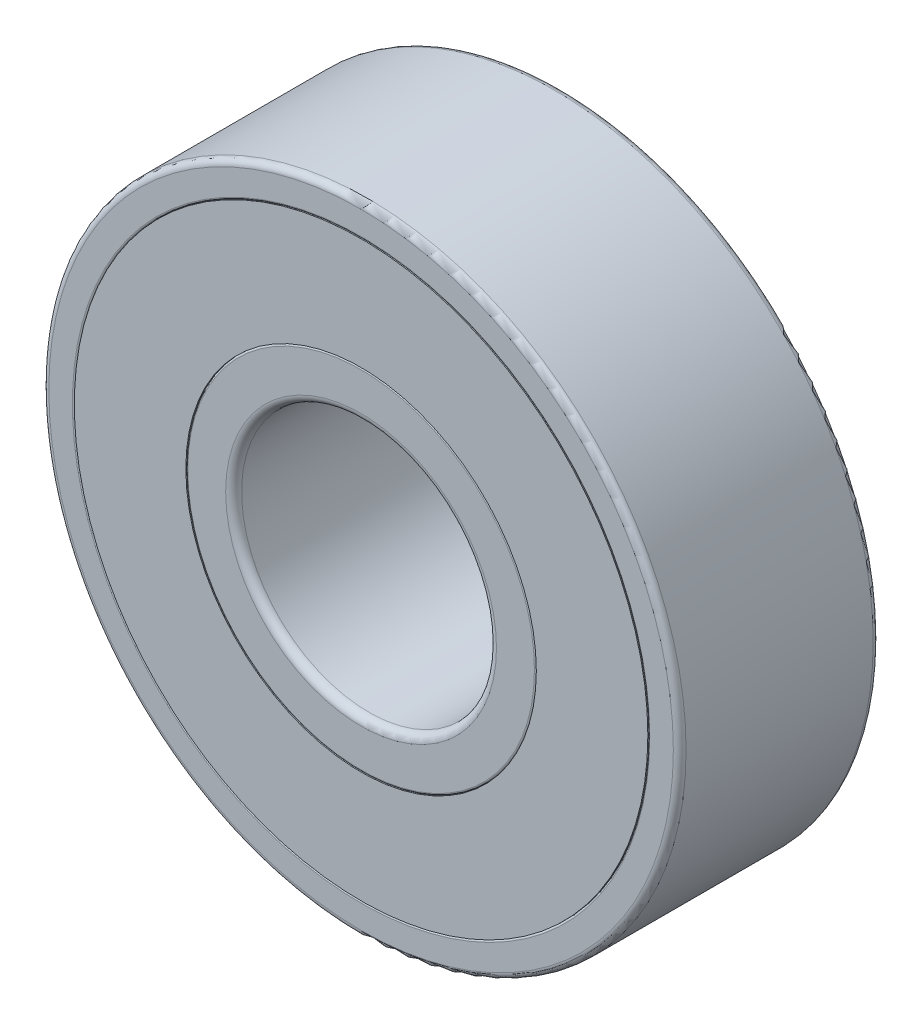
ISO-10303-21;
HEADER;
FILE_DESCRIPTION(('STEP AP214'),'2;1');
FILE_NAME('part.step','',(''),(''),'','','');
FILE_SCHEMA(('AUTOMOTIVE_DESIGN { 1 0 10303 214 1 1 1 1 }'));
ENDSEC;
DATA;
#1=APPLICATION_CONTEXT('core data for automotive mechanical design processes');
#2=APPLICATION_PROTOCOL_DEFINITION('international standard','automotive_design',2000,#1);
#3=PRODUCT_CONTEXT('',#1,'mechanical');
#4=PRODUCT('Part','Part','',(#3));
#5=PRODUCT_RELATED_PRODUCT_CATEGORY('part','',(#4));
#6=PRODUCT_DEFINITION_FORMATION('','',#4);
#7=PRODUCT_DEFINITION_CONTEXT('part definition',#1,'design');
#8=PRODUCT_DEFINITION('design','',#6,#7);
#9=PRODUCT_DEFINITION_SHAPE('','',#8);
#10=(LENGTH_UNIT() NAMED_UNIT(*) SI_UNIT(.MILLI.,.METRE.));
#11=(NAMED_UNIT(*) PLANE_ANGLE_UNIT() SI_UNIT($,.RADIAN.));
#12=(NAMED_UNIT(*) SI_UNIT($,.STERADIAN.) SOLID_ANGLE_UNIT());
#13=UNCERTAINTY_MEASURE_WITH_UNIT(LENGTH_MEASURE(1.E-05),#10,'distance_accuracy_value','');
#14=(GEOMETRIC_REPRESENTATION_CONTEXT(3) GLOBAL_UNCERTAINTY_ASSIGNED_CONTEXT((#13)) GLOBAL_UNIT_ASSIGNED_CONTEXT((#10,
#11,#12)) REPRESENTATION_CONTEXT('',''));
#15=CARTESIAN_POINT('',(0.,0.,0.));
#16=DIRECTION('',(0.,0.,1.));
#17=DIRECTION('',(1.,0.,0.));
#18=AXIS2_PLACEMENT_3D('',#15,#16,#17);
#19=CARTESIAN_POINT('',(0.,0.,2.4892));
#20=DIRECTION('',(0.,0.,1.));
#21=DIRECTION('',(1.,0.,0.));
#22=AXIS2_PLACEMENT_3D('',#19,#20,#21);
#23=PLANE('',#22);
#24=CARTESIAN_POINT('',(0.,0.,2.4892));
#25=DIRECTION('',(0.,0.,1.));
#26=DIRECTION('',(1.,0.,0.));
#27=AXIS2_PLACEMENT_3D('',#24,#25,#26);
#28=CIRCLE('',#27,7.14375);
#29=CARTESIAN_POINT('',(7.14375,0.,2.4892));
#30=VERTEX_POINT('',#29);
#31=EDGE_CURVE('E11',#30,#30,#28,.T.);
#32=ORIENTED_EDGE('',*,*,#31,.T.);
#33=EDGE_LOOP('',(#32));
#34=FACE_BOUND('',#33,.T.);
#35=CARTESIAN_POINT('',(0.,0.,2.4892));
#36=DIRECTION('',(0.,0.,1.));
#37=DIRECTION('',(1.,0.,0.));
#38=AXIS2_PLACEMENT_3D('',#35,#36,#37);
#39=CIRCLE('',#38,4.365625);
#40=CARTESIAN_POINT('',(4.365625,0.,2.4892));
#41=VERTEX_POINT('',#40);
#42=EDGE_CURVE('E67',#41,#41,#39,.T.);
#43=ORIENTED_EDGE('',*,*,#42,.F.);
#44=EDGE_LOOP('',(#43));
#45=FACE_BOUND('',#44,.T.);
#46=ADVANCED_FACE('F54',(#34,#45),#23,.T.);
#47=CARTESIAN_POINT('',(0.,0.,-2.4892));
#48=DIRECTION('',(0.,0.,1.));
#49=DIRECTION('',(1.,0.,0.));
#50=AXIS2_PLACEMENT_3D('',#47,#48,#49);
#51=PLANE('',#50);
#52=CARTESIAN_POINT('',(0.,0.,-2.4892));
#53=DIRECTION('',(0.,0.,1.));
#54=DIRECTION('',(1.,0.,0.));
#55=AXIS2_PLACEMENT_3D('',#52,#53,#54);
#56=CIRCLE('',#55,7.14375);
#57=CARTESIAN_POINT('',(7.14375,0.,-2.4892));
#58=VERTEX_POINT('',#57);
#59=EDGE_CURVE('E58',#58,#58,#56,.T.);
#60=ORIENTED_EDGE('',*,*,#59,.F.);
#61=EDGE_LOOP('',(#60));
#62=FACE_BOUND('',#61,.T.);
#63=CARTESIAN_POINT('',(0.,0.,-2.4892));
#64=DIRECTION('',(0.,0.,1.));
#65=DIRECTION('',(1.,0.,0.));
#66=AXIS2_PLACEMENT_3D('',#63,#64,#65);
#67=CIRCLE('',#66,4.365625);
#68=CARTESIAN_POINT('',(4.365625,0.,-2.4892));
#69=VERTEX_POINT('',#68);
#70=EDGE_CURVE('E69',#69,#69,#67,.T.);
#71=ORIENTED_EDGE('',*,*,#70,.T.);
#72=EDGE_LOOP('',(#71));
#73=FACE_BOUND('',#72,.T.);
#74=ADVANCED_FACE('F81',(#62,#73),#51,.F.);
#75=CARTESIAN_POINT('',(0.,0.,2.4892));
#76=DIRECTION('',(0.,0.,-1.));
#77=DIRECTION('',(-1.,0.,0.));
#78=AXIS2_PLACEMENT_3D('',#75,#76,#77);
#79=CYLINDRICAL_SURFACE('',#78,7.14375);
#80=ORIENTED_EDGE('',*,*,#31,.F.);
#81=EDGE_LOOP('',(#80));
#82=FACE_BOUND('',#81,.T.);
#83=ORIENTED_EDGE('',*,*,#59,.T.);
#84=EDGE_LOOP('',(#83));
#85=FACE_BOUND('',#84,.T.);
#86=ADVANCED_FACE('F56',(#82,#85),#79,.T.);
#87=CARTESIAN_POINT('',(0.,0.,2.4892));
#88=DIRECTION('',(0.,0.,-1.));
#89=DIRECTION('',(-1.,0.,0.));
#90=AXIS2_PLACEMENT_3D('',#87,#88,#89);
#91=CYLINDRICAL_SURFACE('',#90,4.365625);
#92=ORIENTED_EDGE('',*,*,#42,.T.);
#93=EDGE_LOOP('',(#92));
#94=FACE_BOUND('',#93,.T.);
#95=ORIENTED_EDGE('',*,*,#70,.F.);
#96=EDGE_LOOP('',(#95));
#97=FACE_BOUND('',#96,.T.);
#98=ADVANCED_FACE('F77',(#94,#97),#91,.F.);
#99=CLOSED_SHELL('',(#46,#74,#86,#98));
#100=MANIFOLD_SOLID_BREP('B2',#99);
#101=CARTESIAN_POINT('',(4.4991958592652,-3.58798896913399,0.));
#102=DIRECTION('',(-0.781831482468022,0.623489801858743,0.));
#103=DIRECTION('',(0.,0.,-1.));
#104=AXIS2_PLACEMENT_3D('',#101,#102,#103);
#105=SPHERICAL_SURFACE('',#104,1.666875);
#106=CARTESIAN_POINT('',(3.19598050692631,-2.54870940566069,0.));
#107=VERTEX_POINT('',#106);
#108=VERTEX_LOOP('',#107);
#109=FACE_BOUND('',#108,.T.);
#110=ADVANCED_FACE('F130',(#109),#105,.T.);
#111=CLOSED_SHELL('',(#110));
#112=MANIFOLD_SOLID_BREP('B6',#111);
#113=CARTESIAN_POINT('',(5.61040546963385,1.28053843712667,0.));
#114=DIRECTION('',(-0.974927912181826,-0.222520933956305,0.));
#115=DIRECTION('',(0.,0.,-1.));
#116=AXIS2_PLACEMENT_3D('',#113,#114,#115);
#117=SPHERICAL_SURFACE('',#116,1.666875);
#118=CARTESIAN_POINT('',(3.98532250601577,0.909623855338258,0.));
#119=VERTEX_POINT('',#118);
#120=VERTEX_LOOP('',#119);
#121=FACE_BOUND('',#120,.T.);
#122=ADVANCED_FACE('F147',(#121),#117,.T.);
#123=CLOSED_SHELL('',(#122));
#124=MANIFOLD_SOLID_BREP('B50',#123);
#125=CARTESIAN_POINT('',(2.49686532995311,5.18479428200718,0.));
#126=DIRECTION('',(-0.433883739117565,-0.900968867902416,0.));
#127=DIRECTION('',(0.,0.,-1.));
#128=AXIS2_PLACEMENT_3D('',#125,#126,#127);
#129=SPHERICAL_SURFACE('',#128,1.666875);
#130=CARTESIAN_POINT('',(1.77363537231152,3.68299180032234,0.));
#131=VERTEX_POINT('',#130);
#132=VERTEX_LOOP('',#131);
#133=FACE_BOUND('',#132,.T.);
#134=ADVANCED_FACE('F164',(#133),#129,.T.);
#135=CLOSED_SHELL('',(#134));
#136=MANIFOLD_SOLID_BREP('B126',#135);
#137=CARTESIAN_POINT('',(-2.49686532995304,5.18479428200722,0.));
#138=DIRECTION('',(0.433883739117553,-0.900968867902422,0.));
#139=DIRECTION('',(0.,0.,-1.));
#140=AXIS2_PLACEMENT_3D('',#137,#138,#139);
#141=SPHERICAL_SURFACE('',#140,1.666875);
#142=CARTESIAN_POINT('',(-1.77363537231147,3.68299180032237,0.));
#143=VERTEX_POINT('',#142);
#144=VERTEX_LOOP('',#143);
#145=FACE_BOUND('',#144,.T.);
#146=ADVANCED_FACE('F181',(#145),#141,.T.);
#147=CLOSED_SHELL('',(#146));
#148=MANIFOLD_SOLID_BREP('B143',#147);
#149=CARTESIAN_POINT('',(-5.61040546963383,1.28053843712675,0.));
#150=DIRECTION('',(0.974927912181823,-0.222520933956318,0.));
#151=DIRECTION('',(0.,0.,-1.));
#152=AXIS2_PLACEMENT_3D('',#149,#150,#151);
#153=SPHERICAL_SURFACE('',#152,1.666875);
#154=CARTESIAN_POINT('',(-3.98532250601576,0.909623855338312,0.));
#155=VERTEX_POINT('',#154);
#156=VERTEX_LOOP('',#155);
#157=FACE_BOUND('',#156,.T.);
#158=ADVANCED_FACE('F198',(#157),#153,.T.);
#159=CLOSED_SHELL('',(#158));
#160=MANIFOLD_SOLID_BREP('B160',#159);
#161=CARTESIAN_POINT('',(-4.49919585926525,-3.58798896913392,0.));
#162=DIRECTION('',(0.781831482468031,0.623489801858732,0.));
#163=DIRECTION('',(0.,0.,-1.));
#164=AXIS2_PLACEMENT_3D('',#161,#162,#163);
#165=SPHERICAL_SURFACE('',#164,1.666875);
#166=CARTESIAN_POINT('',(-3.19598050692635,-2.54870940566065,0.));
#167=VERTEX_POINT('',#166);
#168=VERTEX_LOOP('',#167);
#169=FACE_BOUND('',#168,.T.);
#170=ADVANCED_FACE('F215',(#169),#165,.T.);
#171=CLOSED_SHELL('',(#170));
#172=MANIFOLD_SOLID_BREP('B177',#171);
#173=CARTESIAN_POINT('',(0.,-5.7546875,0.));
#174=DIRECTION('',(0.,1.,0.));
#175=DIRECTION('',(0.,0.,-1.));
#176=AXIS2_PLACEMENT_3D('',#173,#174,#175);
#177=SPHERICAL_SURFACE('',#176,1.666875);
#178=CARTESIAN_POINT('',(0.,-4.0878125,0.));
#179=VERTEX_POINT('',#178);
#180=VERTEX_LOOP('',#179);
#181=FACE_BOUND('',#180,.T.);
#182=ADVANCED_FACE('F234',(#181),#177,.T.);
#183=CLOSED_SHELL('',(#182));
#184=MANIFOLD_SOLID_BREP('B194',#183);
#185=CARTESIAN_POINT('',(0.,0.,2.4892));
#186=DIRECTION('',(0.,0.,1.));
#187=DIRECTION('',(1.,0.,0.));
#188=AXIS2_PLACEMENT_3D('',#185,#186,#187);
#189=CYLINDRICAL_SURFACE('',#188,4.365625);
#190=CARTESIAN_POINT('',(0.,0.,2.441575));
#191=DIRECTION('',(0.,0.,1.));
#192=DIRECTION('',(1.,0.,0.));
#193=AXIS2_PLACEMENT_3D('',#190,#191,#192);
#194=CIRCLE('',#193,4.365625);
#195=CARTESIAN_POINT('',(4.365625,0.,2.441575));
#196=VERTEX_POINT('',#195);
#197=EDGE_CURVE('E233',#196,#196,#194,.F.);
#198=ORIENTED_EDGE('',*,*,#197,.T.);
#199=EDGE_LOOP('',(#198));
#200=FACE_BOUND('',#199,.T.);
#201=CARTESIAN_POINT('',(0.,0.,0.921399824570606));
#202=DIRECTION('',(0.,0.,-1.));
#203=DIRECTION('',(-1.,0.,0.));
#204=AXIS2_PLACEMENT_3D('',#201,#202,#203);
#205=CIRCLE('',#204,4.365625);
#206=CARTESIAN_POINT('',(-4.365625,0.,0.921399824570606));
#207=VERTEX_POINT('',#206);
#208=EDGE_CURVE('E284',#207,#207,#205,.T.);
#209=ORIENTED_EDGE('',*,*,#208,.F.);
#210=EDGE_LOOP('',(#209));
#211=FACE_BOUND('',#210,.T.);
#212=ADVANCED_FACE('F252',(#200,#211),#189,.T.);
#213=CARTESIAN_POINT('',(0.,-4.365625,2.4892));
#214=DIRECTION('',(0.,0.,1.));
#215=DIRECTION('',(1.,0.,0.));
#216=AXIS2_PLACEMENT_3D('',#213,#214,#215);
#217=PLANE('',#216);
#218=CARTESIAN_POINT('',(0.,0.,2.4892));
#219=DIRECTION('',(0.,0.,1.));
#220=DIRECTION('',(1.,0.,0.));
#221=AXIS2_PLACEMENT_3D('',#218,#219,#220);
#222=CIRCLE('',#221,4.318);
#223=CARTESIAN_POINT('',(4.318,0.,2.4892));
#224=VERTEX_POINT('',#223);
#225=EDGE_CURVE('E259',#224,#224,#222,.T.);
#226=ORIENTED_EDGE('',*,*,#225,.T.);
#227=EDGE_LOOP('',(#226));
#228=FACE_BOUND('',#227,.T.);
#229=CARTESIAN_POINT('',(0.,0.,2.4892));
#230=DIRECTION('',(0.,0.,1.));
#231=DIRECTION('',(1.,0.,0.));
#232=AXIS2_PLACEMENT_3D('',#229,#230,#231);
#233=CIRCLE('',#232,3.3734375);
#234=CARTESIAN_POINT('',(3.3734375,0.,2.4892));
#235=VERTEX_POINT('',#234);
#236=EDGE_CURVE('E272',#235,#235,#233,.F.);
#237=ORIENTED_EDGE('',*,*,#236,.T.);
#238=EDGE_LOOP('',(#237));
#239=FACE_BOUND('',#238,.T.);
#240=ADVANCED_FACE('F310',(#228,#239),#217,.T.);
#241=CARTESIAN_POINT('',(0.,0.,2.4892));
#242=DIRECTION('',(0.,0.,1.));
#243=DIRECTION('',(1.,0.,0.));
#244=AXIS2_PLACEMENT_3D('',#241,#242,#243);
#245=CYLINDRICAL_SURFACE('',#244,3.175);
#246=CARTESIAN_POINT('',(0.,0.,-2.2907625));
#247=DIRECTION('',(0.,0.,-1.));
#248=DIRECTION('',(-1.,0.,0.));
#249=AXIS2_PLACEMENT_3D('',#246,#247,#248);
#250=CIRCLE('',#249,3.175);
#251=CARTESIAN_POINT('',(-3.175,0.,-2.2907625));
#252=VERTEX_POINT('',#251);
#253=EDGE_CURVE('E275',#252,#252,#250,.T.);
#254=ORIENTED_EDGE('',*,*,#253,.T.);
#255=EDGE_LOOP('',(#254));
#256=FACE_BOUND('',#255,.T.);
#257=CARTESIAN_POINT('',(0.,0.,2.2907625));
#258=DIRECTION('',(0.,0.,1.));
#259=DIRECTION('',(1.,0.,0.));
#260=AXIS2_PLACEMENT_3D('',#257,#258,#259);
#261=CIRCLE('',#260,3.175);
#262=CARTESIAN_POINT('',(3.175,0.,2.2907625));
#263=VERTEX_POINT('',#262);
#264=EDGE_CURVE('E278',#263,#263,#261,.T.);
#265=ORIENTED_EDGE('',*,*,#264,.T.);
#266=EDGE_LOOP('',(#265));
#267=FACE_BOUND('',#266,.T.);
#268=ADVANCED_FACE('F306',(#256,#267),#245,.F.);
#269=CARTESIAN_POINT('',(0.,-4.365625,-2.4892));
#270=DIRECTION('',(0.,0.,-1.));
#271=DIRECTION('',(-1.,0.,0.));
#272=AXIS2_PLACEMENT_3D('',#269,#270,#271);
#273=PLANE('',#272);
#274=CARTESIAN_POINT('',(0.,0.,-2.4892));
#275=DIRECTION('',(0.,0.,-1.));
#276=DIRECTION('',(-1.,0.,0.));
#277=AXIS2_PLACEMENT_3D('',#274,#275,#276);
#278=CIRCLE('',#277,4.318);
#279=CARTESIAN_POINT('',(-4.318,0.,-2.4892));
#280=VERTEX_POINT('',#279);
#281=EDGE_CURVE('E263',#280,#280,#278,.T.);
#282=ORIENTED_EDGE('',*,*,#281,.T.);
#283=EDGE_LOOP('',(#282));
#284=FACE_BOUND('',#283,.T.);
#285=CARTESIAN_POINT('',(0.,0.,-2.4892));
#286=DIRECTION('',(0.,0.,-1.));
#287=DIRECTION('',(-1.,0.,0.));
#288=AXIS2_PLACEMENT_3D('',#285,#286,#287);
#289=CIRCLE('',#288,3.3734375);
#290=CARTESIAN_POINT('',(-3.3734375,0.,-2.4892));
#291=VERTEX_POINT('',#290);
#292=EDGE_CURVE('E281',#291,#291,#289,.F.);
#293=ORIENTED_EDGE('',*,*,#292,.T.);
#294=EDGE_LOOP('',(#293));
#295=FACE_BOUND('',#294,.T.);
#296=ADVANCED_FACE('F295',(#284,#295),#273,.T.);
#297=CARTESIAN_POINT('',(0.,0.,-2.441575));
#298=DIRECTION('',(0.,0.,-1.));
#299=DIRECTION('',(-1.,0.,0.));
#300=AXIS2_PLACEMENT_3D('',#297,#298,#299);
#301=CIRCLE('',#300,4.365625);
#302=CARTESIAN_POINT('',(-4.365625,0.,-2.441575));
#303=VERTEX_POINT('',#302);
#304=EDGE_CURVE('E267',#303,#303,#301,.F.);
#305=ORIENTED_EDGE('',*,*,#304,.T.);
#306=EDGE_LOOP('',(#305));
#307=FACE_BOUND('',#306,.T.);
#308=CARTESIAN_POINT('',(0.,0.,-0.921399824570606));
#309=DIRECTION('',(0.,0.,1.));
#310=DIRECTION('',(1.,0.,0.));
#311=AXIS2_PLACEMENT_3D('',#308,#309,#310);
#312=CIRCLE('',#311,4.365625);
#313=CARTESIAN_POINT('',(4.365625,0.,-0.921399824570606));
#314=VERTEX_POINT('',#313);
#315=EDGE_CURVE('E287',#314,#314,#312,.T.);
#316=ORIENTED_EDGE('',*,*,#315,.F.);
#317=EDGE_LOOP('',(#316));
#318=FACE_BOUND('',#317,.T.);
#319=ADVANCED_FACE('F293',(#307,#318),#189,.T.);
#320=CARTESIAN_POINT('',(0.,0.,0.));
#321=DIRECTION('',(0.,0.,1.));
#322=DIRECTION('',(1.,0.,0.));
#323=AXIS2_PLACEMENT_3D('',#320,#321,#322);
#324=TOROIDAL_SURFACE('',#323,5.7546875,1.666875);
#325=ORIENTED_EDGE('',*,*,#208,.T.);
#326=EDGE_LOOP('',(#325));
#327=FACE_BOUND('',#326,.T.);
#328=ORIENTED_EDGE('',*,*,#315,.T.);
#329=EDGE_LOOP('',(#328));
#330=FACE_BOUND('',#329,.T.);
#331=ADVANCED_FACE('F291',(#327,#330),#324,.F.);
#332=CARTESIAN_POINT('',(0.,0.,-2.2907625));
#333=DIRECTION('',(0.,0.,-1.));
#334=DIRECTION('',(-1.,0.,0.));
#335=AXIS2_PLACEMENT_3D('',#332,#333,#334);
#336=TOROIDAL_SURFACE('',#335,3.3734375,0.1984375);
#337=ORIENTED_EDGE('',*,*,#253,.F.);
#338=EDGE_LOOP('',(#337));
#339=FACE_BOUND('',#338,.T.);
#340=ORIENTED_EDGE('',*,*,#292,.F.);
#341=EDGE_LOOP('',(#340));
#342=FACE_BOUND('',#341,.T.);
#343=ADVANCED_FACE('F303',(#339,#342),#336,.T.);
#344=CARTESIAN_POINT('',(0.,0.,2.2907625));
#345=DIRECTION('',(0.,0.,1.));
#346=DIRECTION('',(1.,0.,0.));
#347=AXIS2_PLACEMENT_3D('',#344,#345,#346);
#348=TOROIDAL_SURFACE('',#347,3.3734375,0.1984375);
#349=ORIENTED_EDGE('',*,*,#236,.F.);
#350=EDGE_LOOP('',(#349));
#351=FACE_BOUND('',#350,.T.);
#352=ORIENTED_EDGE('',*,*,#264,.F.);
#353=EDGE_LOOP('',(#352));
#354=FACE_BOUND('',#353,.T.);
#355=ADVANCED_FACE('F327',(#351,#354),#348,.T.);
#356=CARTESIAN_POINT('',(0.,0.,-2.441575));
#357=DIRECTION('',(0.,0.,-1.));
#358=DIRECTION('',(-1.,0.,0.));
#359=AXIS2_PLACEMENT_3D('',#356,#357,#358);
#360=TOROIDAL_SURFACE('',#359,4.318,0.047625);
#361=ORIENTED_EDGE('',*,*,#281,.F.);
#362=EDGE_LOOP('',(#361));
#363=FACE_BOUND('',#362,.T.);
#364=ORIENTED_EDGE('',*,*,#304,.F.);
#365=EDGE_LOOP('',(#364));
#366=FACE_BOUND('',#365,.T.);
#367=ADVANCED_FACE('F329',(#363,#366),#360,.T.);
#368=CARTESIAN_POINT('',(0.,0.,2.441575));
#369=DIRECTION('',(0.,0.,1.));
#370=DIRECTION('',(1.,0.,0.));
#371=AXIS2_PLACEMENT_3D('',#368,#369,#370);
#372=TOROIDAL_SURFACE('',#371,4.318,0.047625);
#373=ORIENTED_EDGE('',*,*,#197,.F.);
#374=EDGE_LOOP('',(#373));
#375=FACE_BOUND('',#374,.T.);
#376=ORIENTED_EDGE('',*,*,#225,.F.);
#377=EDGE_LOOP('',(#376));
#378=FACE_BOUND('',#377,.T.);
#379=ADVANCED_FACE('F254',(#375,#378),#372,.T.);
#380=CLOSED_SHELL('',(#212,#240,#268,#296,#319,#331,#343,#355,#367,#379));
#381=MANIFOLD_SOLID_BREP('B211',#380);
#382=CARTESIAN_POINT('',(0.,0.,2.4892));
#383=DIRECTION('',(0.,0.,1.));
#384=DIRECTION('',(1.,0.,0.));
#385=AXIS2_PLACEMENT_3D('',#382,#383,#384);
#386=CYLINDRICAL_SURFACE('',#385,7.14375);
#387=CARTESIAN_POINT('',(0.,0.,2.441575));
#388=DIRECTION('',(0.,0.,1.));
#389=DIRECTION('',(1.,0.,0.));
#390=AXIS2_PLACEMENT_3D('',#387,#388,#389);
#391=CIRCLE('',#390,7.14375);
#392=CARTESIAN_POINT('',(7.14375,0.,2.441575));
#393=VERTEX_POINT('',#392);
#394=EDGE_CURVE('E390',#393,#393,#391,.T.);
#395=ORIENTED_EDGE('',*,*,#394,.T.);
#396=EDGE_LOOP('',(#395));
#397=FACE_BOUND('',#396,.T.);
#398=CARTESIAN_POINT('',(0.,0.,0.921399824570611));
#399=DIRECTION('',(0.,0.,-1.));
#400=DIRECTION('',(-1.,0.,0.));
#401=AXIS2_PLACEMENT_3D('',#398,#399,#400);
#402=CIRCLE('',#401,7.14375);
#403=CARTESIAN_POINT('',(-7.14375,0.,0.921399824570611));
#404=VERTEX_POINT('',#403);
#405=EDGE_CURVE('E415',#404,#404,#402,.F.);
#406=ORIENTED_EDGE('',*,*,#405,.F.);
#407=EDGE_LOOP('',(#406));
#408=FACE_BOUND('',#407,.T.);
#409=ADVANCED_FACE('F383',(#397,#408),#386,.F.);
#410=CARTESIAN_POINT('',(0.,-7.14375,2.4892));
#411=DIRECTION('',(0.,0.,1.));
#412=DIRECTION('',(1.,0.,0.));
#413=AXIS2_PLACEMENT_3D('',#410,#411,#412);
#414=PLANE('',#413);
#415=CARTESIAN_POINT('',(0.,0.,2.4892));
#416=DIRECTION('',(0.,0.,1.));
#417=DIRECTION('',(1.,0.,0.));
#418=AXIS2_PLACEMENT_3D('',#415,#416,#417);
#419=CIRCLE('',#418,7.191375);
#420=CARTESIAN_POINT('',(7.191375,0.,2.4892));
#421=VERTEX_POINT('',#420);
#422=EDGE_CURVE('E251',#421,#421,#419,.F.);
#423=ORIENTED_EDGE('',*,*,#422,.T.);
#424=EDGE_LOOP('',(#423));
#425=FACE_BOUND('',#424,.T.);
#426=CARTESIAN_POINT('',(0.,0.,2.4892));
#427=DIRECTION('',(0.,0.,1.));
#428=DIRECTION('',(1.,0.,0.));
#429=AXIS2_PLACEMENT_3D('',#426,#427,#428);
#430=CIRCLE('',#429,7.77875);
#431=CARTESIAN_POINT('',(7.77875,0.,2.4892));
#432=VERTEX_POINT('',#431);
#433=EDGE_CURVE('E403',#432,#432,#430,.T.);
#434=ORIENTED_EDGE('',*,*,#433,.T.);
#435=EDGE_LOOP('',(#434));
#436=FACE_BOUND('',#435,.T.);
#437=ADVANCED_FACE('F441',(#425,#436),#414,.T.);
#438=CARTESIAN_POINT('',(0.,0.,2.4892));
#439=DIRECTION('',(0.,0.,1.));
#440=DIRECTION('',(1.,0.,0.));
#441=AXIS2_PLACEMENT_3D('',#438,#439,#440);
#442=CYLINDRICAL_SURFACE('',#441,7.9375);
#443=CARTESIAN_POINT('',(0.,0.,-2.33045));
#444=DIRECTION('',(0.,0.,-1.));
#445=DIRECTION('',(-1.,0.,0.));
#446=AXIS2_PLACEMENT_3D('',#443,#444,#445);
#447=CIRCLE('',#446,7.9375);
#448=CARTESIAN_POINT('',(-7.9375,0.,-2.33045));
#449=VERTEX_POINT('',#448);
#450=EDGE_CURVE('E409',#449,#449,#447,.F.);
#451=ORIENTED_EDGE('',*,*,#450,.T.);
#452=EDGE_LOOP('',(#451));
#453=FACE_BOUND('',#452,.T.);
#454=CARTESIAN_POINT('',(0.,0.,2.33045));
#455=DIRECTION('',(0.,0.,1.));
#456=DIRECTION('',(1.,0.,0.));
#457=AXIS2_PLACEMENT_3D('',#454,#455,#456);
#458=CIRCLE('',#457,7.9375);
#459=CARTESIAN_POINT('',(7.9375,0.,2.33045));
#460=VERTEX_POINT('',#459);
#461=EDGE_CURVE('E412',#460,#460,#458,.F.);
#462=ORIENTED_EDGE('',*,*,#461,.T.);
#463=EDGE_LOOP('',(#462));
#464=FACE_BOUND('',#463,.T.);
#465=ADVANCED_FACE('F437',(#453,#464),#442,.T.);
#466=CARTESIAN_POINT('',(0.,-7.9375,-2.4892));
#467=DIRECTION('',(0.,0.,-1.));
#468=DIRECTION('',(-1.,0.,0.));
#469=AXIS2_PLACEMENT_3D('',#466,#467,#468);
#470=PLANE('',#469);
#471=CARTESIAN_POINT('',(0.,0.,-2.4892));
#472=DIRECTION('',(0.,0.,-1.));
#473=DIRECTION('',(-1.,0.,0.));
#474=AXIS2_PLACEMENT_3D('',#471,#472,#473);
#475=CIRCLE('',#474,7.191375);
#476=CARTESIAN_POINT('',(-7.191375,0.,-2.4892));
#477=VERTEX_POINT('',#476);
#478=EDGE_CURVE('E398',#477,#477,#475,.F.);
#479=ORIENTED_EDGE('',*,*,#478,.T.);
#480=EDGE_LOOP('',(#479));
#481=FACE_BOUND('',#480,.T.);
#482=CARTESIAN_POINT('',(0.,0.,-2.4892));
#483=DIRECTION('',(0.,0.,-1.));
#484=DIRECTION('',(-1.,0.,0.));
#485=AXIS2_PLACEMENT_3D('',#482,#483,#484);
#486=CIRCLE('',#485,7.77875);
#487=CARTESIAN_POINT('',(-7.77875,0.,-2.4892));
#488=VERTEX_POINT('',#487);
#489=EDGE_CURVE('E406',#488,#488,#486,.T.);
#490=ORIENTED_EDGE('',*,*,#489,.T.);
#491=EDGE_LOOP('',(#490));
#492=FACE_BOUND('',#491,.T.);
#493=ADVANCED_FACE('F426',(#481,#492),#470,.T.);
#494=CARTESIAN_POINT('',(0.,0.,-2.441575));
#495=DIRECTION('',(0.,0.,-1.));
#496=DIRECTION('',(-1.,0.,0.));
#497=AXIS2_PLACEMENT_3D('',#494,#495,#496);
#498=CIRCLE('',#497,7.14375);
#499=CARTESIAN_POINT('',(-7.14375,0.,-2.441575));
#500=VERTEX_POINT('',#499);
#501=EDGE_CURVE('E394',#500,#500,#498,.T.);
#502=ORIENTED_EDGE('',*,*,#501,.T.);
#503=EDGE_LOOP('',(#502));
#504=FACE_BOUND('',#503,.T.);
#505=CARTESIAN_POINT('',(0.,0.,-0.921399824570611));
#506=DIRECTION('',(0.,0.,1.));
#507=DIRECTION('',(1.,0.,0.));
#508=AXIS2_PLACEMENT_3D('',#505,#506,#507);
#509=CIRCLE('',#508,7.14375);
#510=CARTESIAN_POINT('',(7.14375,0.,-0.921399824570611));
#511=VERTEX_POINT('',#510);
#512=EDGE_CURVE('E418',#511,#511,#509,.F.);
#513=ORIENTED_EDGE('',*,*,#512,.F.);
#514=EDGE_LOOP('',(#513));
#515=FACE_BOUND('',#514,.T.);
#516=ADVANCED_FACE('F424',(#504,#515),#386,.F.);
#517=CARTESIAN_POINT('',(0.,0.,0.));
#518=DIRECTION('',(0.,0.,1.));
#519=DIRECTION('',(1.,0.,0.));
#520=AXIS2_PLACEMENT_3D('',#517,#518,#519);
#521=TOROIDAL_SURFACE('',#520,5.7546875,1.666875);
#522=ORIENTED_EDGE('',*,*,#405,.T.);
#523=EDGE_LOOP('',(#522));
#524=FACE_BOUND('',#523,.T.);
#525=ORIENTED_EDGE('',*,*,#512,.T.);
#526=EDGE_LOOP('',(#525));
#527=FACE_BOUND('',#526,.T.);
#528=ADVANCED_FACE('F422',(#524,#527),#521,.F.);
#529=CARTESIAN_POINT('',(0.,0.,-2.33045));
#530=DIRECTION('',(0.,0.,-1.));
#531=DIRECTION('',(-1.,0.,0.));
#532=AXIS2_PLACEMENT_3D('',#529,#530,#531);
#533=TOROIDAL_SURFACE('',#532,7.77875,0.15875);
#534=ORIENTED_EDGE('',*,*,#489,.F.);
#535=EDGE_LOOP('',(#534));
#536=FACE_BOUND('',#535,.T.);
#537=ORIENTED_EDGE('',*,*,#450,.F.);
#538=EDGE_LOOP('',(#537));
#539=FACE_BOUND('',#538,.T.);
#540=ADVANCED_FACE('F434',(#536,#539),#533,.T.);
#541=CARTESIAN_POINT('',(0.,0.,2.33045));
#542=DIRECTION('',(0.,0.,1.));
#543=DIRECTION('',(1.,0.,0.));
#544=AXIS2_PLACEMENT_3D('',#541,#542,#543);
#545=TOROIDAL_SURFACE('',#544,7.77875,0.15875);
#546=ORIENTED_EDGE('',*,*,#461,.F.);
#547=EDGE_LOOP('',(#546));
#548=FACE_BOUND('',#547,.T.);
#549=ORIENTED_EDGE('',*,*,#433,.F.);
#550=EDGE_LOOP('',(#549));
#551=FACE_BOUND('',#550,.T.);
#552=ADVANCED_FACE('F458',(#548,#551),#545,.T.);
#553=CARTESIAN_POINT('',(0.,0.,-2.441575));
#554=DIRECTION('',(0.,0.,-1.));
#555=DIRECTION('',(-1.,0.,0.));
#556=AXIS2_PLACEMENT_3D('',#553,#554,#555);
#557=TOROIDAL_SURFACE('',#556,7.191375,0.047625);
#558=ORIENTED_EDGE('',*,*,#501,.F.);
#559=EDGE_LOOP('',(#558));
#560=FACE_BOUND('',#559,.T.);
#561=ORIENTED_EDGE('',*,*,#478,.F.);
#562=EDGE_LOOP('',(#561));
#563=FACE_BOUND('',#562,.T.);
#564=ADVANCED_FACE('F460',(#560,#563),#557,.T.);
#565=CARTESIAN_POINT('',(0.,0.,2.441575));
#566=DIRECTION('',(0.,0.,1.));
#567=DIRECTION('',(1.,0.,0.));
#568=AXIS2_PLACEMENT_3D('',#565,#566,#567);
#569=TOROIDAL_SURFACE('',#568,7.191375,0.047625);
#570=ORIENTED_EDGE('',*,*,#422,.F.);
#571=EDGE_LOOP('',(#570));
#572=FACE_BOUND('',#571,.T.);
#573=ORIENTED_EDGE('',*,*,#394,.F.);
#574=EDGE_LOOP('',(#573));
#575=FACE_BOUND('',#574,.T.);
#576=ADVANCED_FACE('F385',(#572,#575),#569,.T.);
#577=CLOSED_SHELL('',(#409,#437,#465,#493,#516,#528,#540,#552,#564,#576));
#578=MANIFOLD_SOLID_BREP('B228',#577);
#579=ADVANCED_BREP_SHAPE_REPRESENTATION('',(#18,#100,#112,#124,#136,#148,#160,#172,#184,#381,
#578),#14);
#580=SHAPE_DEFINITION_REPRESENTATION(#9,#579);
ENDSEC;
END-ISO-10303-21;
